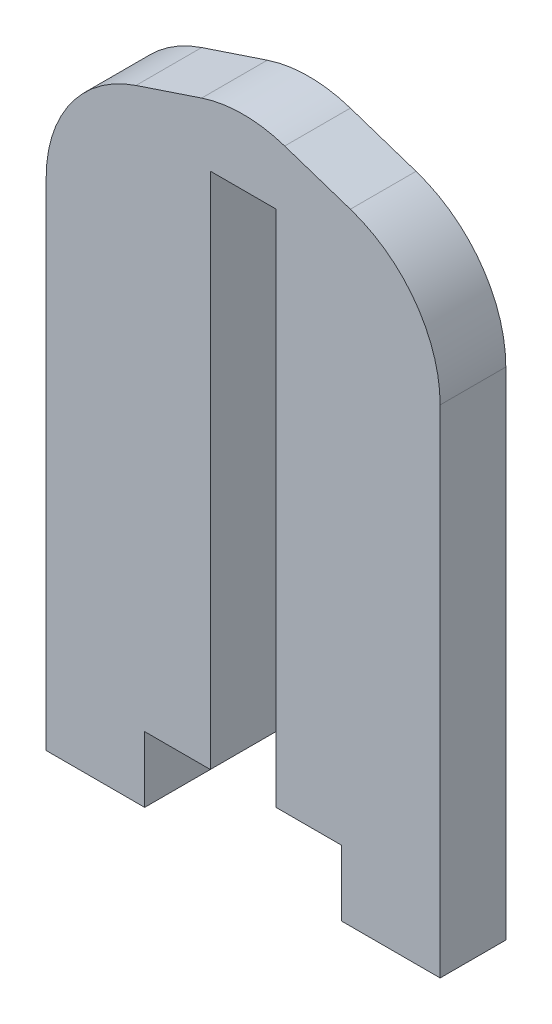
ISO-10303-21;
HEADER;
FILE_DESCRIPTION(('STEP AP214'),'2;1');
FILE_NAME('part.step','',(''),(''),'','','');
FILE_SCHEMA(('AUTOMOTIVE_DESIGN { 1 0 10303 214 1 1 1 1 }'));
ENDSEC;
DATA;
#1=APPLICATION_CONTEXT('core data for automotive mechanical design processes');
#2=APPLICATION_PROTOCOL_DEFINITION('international standard','automotive_design',2000,#1);
#3=PRODUCT_CONTEXT('',#1,'mechanical');
#4=PRODUCT('Part','Part','',(#3));
#5=PRODUCT_RELATED_PRODUCT_CATEGORY('part','',(#4));
#6=PRODUCT_DEFINITION_FORMATION('','',#4);
#7=PRODUCT_DEFINITION_CONTEXT('part definition',#1,'design');
#8=PRODUCT_DEFINITION('design','',#6,#7);
#9=PRODUCT_DEFINITION_SHAPE('','',#8);
#10=(LENGTH_UNIT() NAMED_UNIT(*) SI_UNIT(.MILLI.,.METRE.));
#11=(NAMED_UNIT(*) PLANE_ANGLE_UNIT() SI_UNIT($,.RADIAN.));
#12=(NAMED_UNIT(*) SI_UNIT($,.STERADIAN.) SOLID_ANGLE_UNIT());
#13=UNCERTAINTY_MEASURE_WITH_UNIT(LENGTH_MEASURE(1.E-05),#10,'distance_accuracy_value','');
#14=(GEOMETRIC_REPRESENTATION_CONTEXT(3) GLOBAL_UNCERTAINTY_ASSIGNED_CONTEXT((#13)) GLOBAL_UNIT_ASSIGNED_CONTEXT((#10,
#11,#12)) REPRESENTATION_CONTEXT('',''));
#15=CARTESIAN_POINT('',(0.,0.,0.));
#16=DIRECTION('',(0.,0.,1.));
#17=DIRECTION('',(1.,0.,0.));
#18=AXIS2_PLACEMENT_3D('',#15,#16,#17);
#19=CARTESIAN_POINT('',(-9.525,-31.75,6.35));
#20=DIRECTION('',(0.,1.,0.));
#21=DIRECTION('',(0.,0.,1.));
#22=AXIS2_PLACEMENT_3D('',#19,#20,#21);
#23=PLANE('',#22);
#24=DIRECTION('',(1.,0.,0.));
#25=VECTOR('',#24,1.);
#26=CARTESIAN_POINT('',(-9.525,-31.75,6.35));
#27=LINE('',#26,#25);
#28=CARTESIAN_POINT('',(3.17500000000001,-31.75,6.35));
#29=VERTEX_POINT('',#28);
#30=CARTESIAN_POINT('',(9.525,-31.75,6.35));
#31=VERTEX_POINT('',#30);
#32=EDGE_CURVE('E210',#29,#31,#27,.T.);
#33=ORIENTED_EDGE('',*,*,#32,.F.);
#34=DIRECTION('',(0.,0.,1.));
#35=VECTOR('',#34,1.);
#36=CARTESIAN_POINT('',(3.17500000000001,-31.75,0.));
#37=LINE('',#36,#35);
#38=CARTESIAN_POINT('',(3.17500000000001,-31.75,0.));
#39=VERTEX_POINT('',#38);
#40=EDGE_CURVE('E182',#39,#29,#37,.T.);
#41=ORIENTED_EDGE('',*,*,#40,.F.);
#42=DIRECTION('',(1.,0.,0.));
#43=VECTOR('',#42,1.);
#44=CARTESIAN_POINT('',(-9.525,-31.75,0.));
#45=LINE('',#44,#43);
#46=CARTESIAN_POINT('',(9.525,-31.75,0.));
#47=VERTEX_POINT('',#46);
#48=EDGE_CURVE('E176',#39,#47,#45,.T.);
#49=ORIENTED_EDGE('',*,*,#48,.T.);
#50=DIRECTION('',(0.,0.,-1.));
#51=VECTOR('',#50,1.);
#52=CARTESIAN_POINT('',(9.525,-31.75,6.35));
#53=LINE('',#52,#51);
#54=EDGE_CURVE('E269',#31,#47,#53,.T.);
#55=ORIENTED_EDGE('',*,*,#54,.F.);
#56=EDGE_LOOP('',(#33,#41,#49,#55));
#57=FACE_BOUND('',#56,.T.);
#58=ADVANCED_FACE('F39',(#57),#23,.F.);
#59=CARTESIAN_POINT('',(-19.05,-38.1,6.35));
#60=DIRECTION('',(0.,1.,0.));
#61=DIRECTION('',(0.,0.,1.));
#62=AXIS2_PLACEMENT_3D('',#59,#60,#61);
#63=PLANE('',#62);
#64=DIRECTION('',(1.,0.,0.));
#65=VECTOR('',#64,1.);
#66=CARTESIAN_POINT('',(-19.05,-38.1,0.));
#67=LINE('',#66,#65);
#68=CARTESIAN_POINT('',(-19.05,-38.1,0.));
#69=VERTEX_POINT('',#68);
#70=CARTESIAN_POINT('',(-9.525,-38.1,0.));
#71=VERTEX_POINT('',#70);
#72=EDGE_CURVE('E199',#69,#71,#67,.T.);
#73=ORIENTED_EDGE('',*,*,#72,.T.);
#74=DIRECTION('',(0.,0.,-1.));
#75=VECTOR('',#74,1.);
#76=CARTESIAN_POINT('',(-9.525,-38.1,6.35));
#77=LINE('',#76,#75);
#78=CARTESIAN_POINT('',(-9.525,-38.1,6.35));
#79=VERTEX_POINT('',#78);
#80=EDGE_CURVE('E277',#79,#71,#77,.T.);
#81=ORIENTED_EDGE('',*,*,#80,.F.);
#82=DIRECTION('',(1.,0.,0.));
#83=VECTOR('',#82,1.);
#84=CARTESIAN_POINT('',(-19.05,-38.1,6.35));
#85=LINE('',#84,#83);
#86=CARTESIAN_POINT('',(-19.05,-38.1,6.35));
#87=VERTEX_POINT('',#86);
#88=EDGE_CURVE('E203',#87,#79,#85,.T.);
#89=ORIENTED_EDGE('',*,*,#88,.F.);
#90=DIRECTION('',(0.,0.,-1.));
#91=VECTOR('',#90,1.);
#92=CARTESIAN_POINT('',(-19.05,-38.1,6.35));
#93=LINE('',#92,#91);
#94=EDGE_CURVE('E281',#87,#69,#93,.T.);
#95=ORIENTED_EDGE('',*,*,#94,.T.);
#96=EDGE_LOOP('',(#73,#81,#89,#95));
#97=FACE_BOUND('',#96,.T.);
#98=ADVANCED_FACE('F347',(#97),#63,.F.);
#99=CARTESIAN_POINT('',(-9.525,-31.75,6.35));
#100=DIRECTION('',(-1.,0.,0.));
#101=DIRECTION('',(0.,0.,1.));
#102=AXIS2_PLACEMENT_3D('',#99,#100,#101);
#103=PLANE('',#102);
#104=DIRECTION('',(0.,1.,0.));
#105=VECTOR('',#104,1.);
#106=CARTESIAN_POINT('',(-9.525,-31.75,0.));
#107=LINE('',#106,#105);
#108=CARTESIAN_POINT('',(-9.525,-31.75,0.));
#109=VERTEX_POINT('',#108);
#110=EDGE_CURVE('E235',#71,#109,#107,.T.);
#111=ORIENTED_EDGE('',*,*,#110,.T.);
#112=DIRECTION('',(0.,0.,-1.));
#113=VECTOR('',#112,1.);
#114=CARTESIAN_POINT('',(-9.525,-31.75,6.35));
#115=LINE('',#114,#113);
#116=CARTESIAN_POINT('',(-9.525,-31.75,6.35));
#117=VERTEX_POINT('',#116);
#118=EDGE_CURVE('E273',#117,#109,#115,.T.);
#119=ORIENTED_EDGE('',*,*,#118,.F.);
#120=DIRECTION('',(0.,1.,0.));
#121=VECTOR('',#120,1.);
#122=CARTESIAN_POINT('',(-9.525,-31.75,6.35));
#123=LINE('',#122,#121);
#124=EDGE_CURVE('E207',#79,#117,#123,.T.);
#125=ORIENTED_EDGE('',*,*,#124,.F.);
#126=ORIENTED_EDGE('',*,*,#80,.T.);
#127=EDGE_LOOP('',(#111,#119,#125,#126));
#128=FACE_BOUND('',#127,.T.);
#129=ADVANCED_FACE('F353',(#128),#103,.F.);
#130=CARTESIAN_POINT('',(-3.17499999999999,-31.75,0.));
#131=VERTEX_POINT('',#130);
#132=EDGE_CURVE('E238',#109,#131,#45,.T.);
#133=ORIENTED_EDGE('',*,*,#132,.T.);
#134=DIRECTION('',(0.,0.,1.));
#135=VECTOR('',#134,1.);
#136=CARTESIAN_POINT('',(-3.17499999999999,-31.75,0.));
#137=LINE('',#136,#135);
#138=CARTESIAN_POINT('',(-3.17499999999999,-31.75,6.35));
#139=VERTEX_POINT('',#138);
#140=EDGE_CURVE('E186',#131,#139,#137,.T.);
#141=ORIENTED_EDGE('',*,*,#140,.T.);
#142=EDGE_CURVE('E211',#117,#139,#27,.T.);
#143=ORIENTED_EDGE('',*,*,#142,.F.);
#144=ORIENTED_EDGE('',*,*,#118,.T.);
#145=EDGE_LOOP('',(#133,#141,#143,#144));
#146=FACE_BOUND('',#145,.T.);
#147=ADVANCED_FACE('F355',(#146),#23,.F.);
#148=CARTESIAN_POINT('',(9.525,-31.75,6.35));
#149=DIRECTION('',(1.,0.,0.));
#150=DIRECTION('',(0.,0.,-1.));
#151=AXIS2_PLACEMENT_3D('',#148,#149,#150);
#152=PLANE('',#151);
#153=DIRECTION('',(0.,-1.,0.));
#154=VECTOR('',#153,1.);
#155=CARTESIAN_POINT('',(9.525,-31.75,0.));
#156=LINE('',#155,#154);
#157=CARTESIAN_POINT('',(9.525,-38.1,0.));
#158=VERTEX_POINT('',#157);
#159=EDGE_CURVE('E242',#47,#158,#156,.T.);
#160=ORIENTED_EDGE('',*,*,#159,.T.);
#161=DIRECTION('',(0.,0.,-1.));
#162=VECTOR('',#161,1.);
#163=CARTESIAN_POINT('',(9.525,-38.1,6.35));
#164=LINE('',#163,#162);
#165=CARTESIAN_POINT('',(9.525,-38.1,6.35));
#166=VERTEX_POINT('',#165);
#167=EDGE_CURVE('E265',#166,#158,#164,.T.);
#168=ORIENTED_EDGE('',*,*,#167,.F.);
#169=DIRECTION('',(0.,-1.,0.));
#170=VECTOR('',#169,1.);
#171=CARTESIAN_POINT('',(9.525,-31.75,6.35));
#172=LINE('',#171,#170);
#173=EDGE_CURVE('E215',#31,#166,#172,.T.);
#174=ORIENTED_EDGE('',*,*,#173,.F.);
#175=ORIENTED_EDGE('',*,*,#54,.T.);
#176=EDGE_LOOP('',(#160,#168,#174,#175));
#177=FACE_BOUND('',#176,.T.);
#178=ADVANCED_FACE('F364',(#177),#152,.F.);
#179=CARTESIAN_POINT('',(19.05,-38.1,6.35));
#180=DIRECTION('',(0.,1.,0.));
#181=DIRECTION('',(-1.,0.,0.));
#182=AXIS2_PLACEMENT_3D('',#179,#180,#181);
#183=PLANE('',#182);
#184=DIRECTION('',(1.,0.,0.));
#185=VECTOR('',#184,1.);
#186=CARTESIAN_POINT('',(19.05,-38.1,0.));
#187=LINE('',#186,#185);
#188=CARTESIAN_POINT('',(19.05,-38.1,0.));
#189=VERTEX_POINT('',#188);
#190=EDGE_CURVE('E245',#158,#189,#187,.T.);
#191=ORIENTED_EDGE('',*,*,#190,.T.);
#192=DIRECTION('',(0.,0.,-1.));
#193=VECTOR('',#192,1.);
#194=CARTESIAN_POINT('',(19.05,-38.1,6.35));
#195=LINE('',#194,#193);
#196=CARTESIAN_POINT('',(19.05,-38.1,6.35));
#197=VERTEX_POINT('',#196);
#198=EDGE_CURVE('E232',#197,#189,#195,.T.);
#199=ORIENTED_EDGE('',*,*,#198,.F.);
#200=DIRECTION('',(1.,0.,0.));
#201=VECTOR('',#200,1.);
#202=CARTESIAN_POINT('',(19.05,-38.1,6.35));
#203=LINE('',#202,#201);
#204=EDGE_CURVE('E218',#166,#197,#203,.T.);
#205=ORIENTED_EDGE('',*,*,#204,.F.);
#206=ORIENTED_EDGE('',*,*,#167,.T.);
#207=EDGE_LOOP('',(#191,#199,#205,#206));
#208=FACE_BOUND('',#207,.T.);
#209=ADVANCED_FACE('F369',(#208),#183,.F.);
#210=CARTESIAN_POINT('',(19.05,-31.75,6.35));
#211=DIRECTION('',(-1.,0.,0.));
#212=DIRECTION('',(0.,0.,1.));
#213=AXIS2_PLACEMENT_3D('',#210,#211,#212);
#214=PLANE('',#213);
#215=DIRECTION('',(0.,1.,0.));
#216=VECTOR('',#215,1.);
#217=CARTESIAN_POINT('',(19.05,-31.75,0.));
#218=LINE('',#217,#216);
#219=CARTESIAN_POINT('',(19.05,9.89635790528719,0.));
#220=VERTEX_POINT('',#219);
#221=EDGE_CURVE('E249',#189,#220,#218,.T.);
#222=ORIENTED_EDGE('',*,*,#221,.T.);
#223=DIRECTION('',(0.,0.,-1.));
#224=VECTOR('',#223,1.);
#225=CARTESIAN_POINT('',(19.05,9.89635790528719,6.35));
#226=LINE('',#225,#224);
#227=CARTESIAN_POINT('',(19.05,9.89635790528719,6.35));
#228=VERTEX_POINT('',#227);
#229=EDGE_CURVE('E11',#220,#228,#226,.F.);
#230=ORIENTED_EDGE('',*,*,#229,.T.);
#231=DIRECTION('',(0.,1.,0.));
#232=VECTOR('',#231,1.);
#233=CARTESIAN_POINT('',(19.05,-31.75,6.35));
#234=LINE('',#233,#232);
#235=EDGE_CURVE('E221',#197,#228,#234,.T.);
#236=ORIENTED_EDGE('',*,*,#235,.F.);
#237=ORIENTED_EDGE('',*,*,#198,.T.);
#238=EDGE_LOOP('',(#222,#230,#236,#237));
#239=FACE_BOUND('',#238,.T.);
#240=ADVANCED_FACE('F373',(#239),#214,.F.);
#241=CARTESIAN_POINT('',(0.,25.4,6.35));
#242=DIRECTION('',(-0.316227766016838,-0.948683298050514,0.));
#243=DIRECTION('',(0.948683298050514,-0.316227766016838,0.));
#244=AXIS2_PLACEMENT_3D('',#241,#242,#243);
#245=PLANE('',#244);
#246=DIRECTION('',(-0.948683298050514,0.316227766016838,0.));
#247=VECTOR('',#246,1.);
#248=CARTESIAN_POINT('',(0.,25.4,6.35));
#249=LINE('',#248,#247);
#250=CARTESIAN_POINT('',(10.3660926284138,21.9446357905287,6.35));
#251=VERTEX_POINT('',#250);
#252=CARTESIAN_POINT('',(4.01609262841383,24.0613024571954,6.35));
#253=VERTEX_POINT('',#252);
#254=EDGE_CURVE('E225',#251,#253,#249,.T.);
#255=ORIENTED_EDGE('',*,*,#254,.F.);
#256=DIRECTION('',(0.,0.,-1.));
#257=VECTOR('',#256,1.);
#258=CARTESIAN_POINT('',(10.3660926284138,21.9446357905287,6.35));
#259=LINE('',#258,#257);
#260=CARTESIAN_POINT('',(10.3660926284138,21.9446357905287,0.));
#261=VERTEX_POINT('',#260);
#262=EDGE_CURVE('E48',#251,#261,#259,.T.);
#263=ORIENTED_EDGE('',*,*,#262,.T.);
#264=DIRECTION('',(-0.948683298050514,0.316227766016838,0.));
#265=VECTOR('',#264,1.);
#266=CARTESIAN_POINT('',(0.,25.4,0.));
#267=LINE('',#266,#265);
#268=CARTESIAN_POINT('',(4.01609262841383,24.0613024571954,0.));
#269=VERTEX_POINT('',#268);
#270=EDGE_CURVE('E253',#261,#269,#267,.T.);
#271=ORIENTED_EDGE('',*,*,#270,.T.);
#272=DIRECTION('',(0.,0.,-1.));
#273=VECTOR('',#272,1.);
#274=CARTESIAN_POINT('',(4.01609262841383,24.0613024571954,6.35));
#275=LINE('',#274,#273);
#276=EDGE_CURVE('E63',#269,#253,#275,.F.);
#277=ORIENTED_EDGE('',*,*,#276,.T.);
#278=EDGE_LOOP('',(#255,#263,#271,#277));
#279=FACE_BOUND('',#278,.T.);
#280=ADVANCED_FACE('F319',(#279),#245,.F.);
#281=CARTESIAN_POINT('',(-19.05,19.05,6.35));
#282=DIRECTION('',(0.316227766016838,-0.948683298050514,0.));
#283=DIRECTION('',(0.948683298050514,0.316227766016838,0.));
#284=AXIS2_PLACEMENT_3D('',#281,#282,#283);
#285=PLANE('',#284);
#286=DIRECTION('',(-0.948683298050514,-0.316227766016838,0.));
#287=VECTOR('',#286,1.);
#288=CARTESIAN_POINT('',(-19.05,19.05,0.));
#289=LINE('',#288,#287);
#290=CARTESIAN_POINT('',(-4.01609262841385,24.0613024571954,0.));
#291=VERTEX_POINT('',#290);
#292=CARTESIAN_POINT('',(-10.3660926284138,21.9446357905287,0.));
#293=VERTEX_POINT('',#292);
#294=EDGE_CURVE('E256',#291,#293,#289,.T.);
#295=ORIENTED_EDGE('',*,*,#294,.T.);
#296=DIRECTION('',(0.,0.,-1.));
#297=VECTOR('',#296,1.);
#298=CARTESIAN_POINT('',(-10.3660926284138,21.9446357905287,6.35));
#299=LINE('',#298,#297);
#300=CARTESIAN_POINT('',(-10.3660926284138,21.9446357905287,6.35));
#301=VERTEX_POINT('',#300);
#302=EDGE_CURVE('E302',#293,#301,#299,.F.);
#303=ORIENTED_EDGE('',*,*,#302,.T.);
#304=DIRECTION('',(-0.948683298050514,-0.316227766016838,0.));
#305=VECTOR('',#304,1.);
#306=CARTESIAN_POINT('',(-19.05,19.05,6.35));
#307=LINE('',#306,#305);
#308=CARTESIAN_POINT('',(-4.01609262841385,24.0613024571954,6.35));
#309=VERTEX_POINT('',#308);
#310=EDGE_CURVE('E228',#309,#301,#307,.T.);
#311=ORIENTED_EDGE('',*,*,#310,.F.);
#312=DIRECTION('',(0.,0.,-1.));
#313=VECTOR('',#312,1.);
#314=CARTESIAN_POINT('',(-4.01609262841385,24.0613024571954,6.35));
#315=LINE('',#314,#313);
#316=EDGE_CURVE('E298',#309,#291,#315,.T.);
#317=ORIENTED_EDGE('',*,*,#316,.T.);
#318=EDGE_LOOP('',(#295,#303,#311,#317));
#319=FACE_BOUND('',#318,.T.);
#320=ADVANCED_FACE('F328',(#319),#285,.F.);
#321=CARTESIAN_POINT('',(-19.05,-31.75,6.35));
#322=DIRECTION('',(1.,0.,0.));
#323=DIRECTION('',(0.,0.,-1.));
#324=AXIS2_PLACEMENT_3D('',#321,#322,#323);
#325=PLANE('',#324);
#326=DIRECTION('',(0.,-1.,0.));
#327=VECTOR('',#326,1.);
#328=CARTESIAN_POINT('',(-19.05,-31.75,6.35));
#329=LINE('',#328,#327);
#330=CARTESIAN_POINT('',(-19.05,9.89635790528719,6.35));
#331=VERTEX_POINT('',#330);
#332=EDGE_CURVE('E200',#331,#87,#329,.T.);
#333=ORIENTED_EDGE('',*,*,#332,.F.);
#334=DIRECTION('',(0.,0.,-1.));
#335=VECTOR('',#334,1.);
#336=CARTESIAN_POINT('',(-19.05,9.89635790528719,6.35));
#337=LINE('',#336,#335);
#338=CARTESIAN_POINT('',(-19.05,9.89635790528719,0.));
#339=VERTEX_POINT('',#338);
#340=EDGE_CURVE('E285',#331,#339,#337,.T.);
#341=ORIENTED_EDGE('',*,*,#340,.T.);
#342=DIRECTION('',(0.,-1.,0.));
#343=VECTOR('',#342,1.);
#344=CARTESIAN_POINT('',(-19.05,-31.75,0.));
#345=LINE('',#344,#343);
#346=EDGE_CURVE('E204',#339,#69,#345,.T.);
#347=ORIENTED_EDGE('',*,*,#346,.T.);
#348=ORIENTED_EDGE('',*,*,#94,.F.);
#349=EDGE_LOOP('',(#333,#341,#347,#348));
#350=FACE_BOUND('',#349,.T.);
#351=ADVANCED_FACE('F339',(#350),#325,.F.);
#352=CARTESIAN_POINT('',(0.,0.,6.35));
#353=DIRECTION('',(0.,0.,1.));
#354=DIRECTION('',(1.,0.,0.));
#355=AXIS2_PLACEMENT_3D('',#352,#353,#354);
#356=PLANE('',#355);
#357=DIRECTION('',(0.,1.,0.));
#358=VECTOR('',#357,1.);
#359=CARTESIAN_POINT('',(3.175,0.,6.35));
#360=LINE('',#359,#358);
#361=CARTESIAN_POINT('',(3.175,18.3630245719539,6.35));
#362=VERTEX_POINT('',#361);
#363=EDGE_CURVE('E161',#29,#362,#360,.T.);
#364=ORIENTED_EDGE('',*,*,#363,.F.);
#365=ORIENTED_EDGE('',*,*,#32,.T.);
#366=ORIENTED_EDGE('',*,*,#173,.T.);
#367=ORIENTED_EDGE('',*,*,#204,.T.);
#368=ORIENTED_EDGE('',*,*,#235,.T.);
#369=CARTESIAN_POINT('',(6.35,9.89635790528719,6.35));
#370=DIRECTION('',(0.,0.,1.));
#371=DIRECTION('',(1.,0.,0.));
#372=AXIS2_PLACEMENT_3D('',#369,#370,#371);
#373=CIRCLE('',#372,12.7);
#374=EDGE_CURVE('E308',#228,#251,#373,.T.);
#375=ORIENTED_EDGE('',*,*,#374,.T.);
#376=ORIENTED_EDGE('',*,*,#254,.T.);
#377=CARTESIAN_POINT('',(0.,12.0130245719539,6.35));
#378=DIRECTION('',(0.,0.,1.));
#379=DIRECTION('',(1.,0.,0.));
#380=AXIS2_PLACEMENT_3D('',#377,#378,#379);
#381=CIRCLE('',#380,12.7);
#382=EDGE_CURVE('E305',#253,#309,#381,.T.);
#383=ORIENTED_EDGE('',*,*,#382,.T.);
#384=ORIENTED_EDGE('',*,*,#310,.T.);
#385=CARTESIAN_POINT('',(-6.35,9.89635790528719,6.35));
#386=DIRECTION('',(0.,0.,1.));
#387=DIRECTION('',(1.,0.,0.));
#388=AXIS2_PLACEMENT_3D('',#385,#386,#387);
#389=CIRCLE('',#388,12.7);
#390=EDGE_CURVE('E311',#301,#331,#389,.T.);
#391=ORIENTED_EDGE('',*,*,#390,.T.);
#392=ORIENTED_EDGE('',*,*,#332,.T.);
#393=ORIENTED_EDGE('',*,*,#88,.T.);
#394=ORIENTED_EDGE('',*,*,#124,.T.);
#395=ORIENTED_EDGE('',*,*,#142,.T.);
#396=DIRECTION('',(0.,-1.,0.));
#397=VECTOR('',#396,1.);
#398=CARTESIAN_POINT('',(-3.175,0.,6.35));
#399=LINE('',#398,#397);
#400=CARTESIAN_POINT('',(-3.175,18.3630245719539,6.35));
#401=VERTEX_POINT('',#400);
#402=EDGE_CURVE('E194',#401,#139,#399,.T.);
#403=ORIENTED_EDGE('',*,*,#402,.F.);
#404=DIRECTION('',(-1.,0.,0.));
#405=VECTOR('',#404,1.);
#406=CARTESIAN_POINT('',(0.,18.3630245719539,6.35));
#407=LINE('',#406,#405);
#408=EDGE_CURVE('E185',#362,#401,#407,.T.);
#409=ORIENTED_EDGE('',*,*,#408,.F.);
#410=EDGE_LOOP('',(#364,#365,#366,#367,#368,#375,#376,#383,#384,#391,#392,#393,#394,#395,#403,#409));
#411=FACE_BOUND('',#410,.T.);
#412=ADVANCED_FACE('F332',(#411),#356,.T.);
#413=CARTESIAN_POINT('',(0.,0.,0.));
#414=DIRECTION('',(0.,0.,1.));
#415=DIRECTION('',(1.,0.,0.));
#416=AXIS2_PLACEMENT_3D('',#413,#414,#415);
#417=PLANE('',#416);
#418=ORIENTED_EDGE('',*,*,#48,.F.);
#419=DIRECTION('',(0.,1.,0.));
#420=VECTOR('',#419,1.);
#421=CARTESIAN_POINT('',(3.175,18.3630245719539,0.));
#422=LINE('',#421,#420);
#423=CARTESIAN_POINT('',(3.175,18.3630245719539,0.));
#424=VERTEX_POINT('',#423);
#425=EDGE_CURVE('E158',#39,#424,#422,.T.);
#426=ORIENTED_EDGE('',*,*,#425,.T.);
#427=DIRECTION('',(-1.,0.,0.));
#428=VECTOR('',#427,1.);
#429=CARTESIAN_POINT('',(-3.175,18.3630245719539,0.));
#430=LINE('',#429,#428);
#431=CARTESIAN_POINT('',(-3.175,18.3630245719539,0.));
#432=VERTEX_POINT('',#431);
#433=EDGE_CURVE('E168',#424,#432,#430,.T.);
#434=ORIENTED_EDGE('',*,*,#433,.T.);
#435=DIRECTION('',(0.,-1.,0.));
#436=VECTOR('',#435,1.);
#437=CARTESIAN_POINT('',(-3.175,18.3630245719539,0.));
#438=LINE('',#437,#436);
#439=EDGE_CURVE('E55',#432,#131,#438,.T.);
#440=ORIENTED_EDGE('',*,*,#439,.T.);
#441=ORIENTED_EDGE('',*,*,#132,.F.);
#442=ORIENTED_EDGE('',*,*,#110,.F.);
#443=ORIENTED_EDGE('',*,*,#72,.F.);
#444=ORIENTED_EDGE('',*,*,#346,.F.);
#445=CARTESIAN_POINT('',(-6.35,9.89635790528719,0.));
#446=DIRECTION('',(0.,0.,1.));
#447=DIRECTION('',(1.,0.,0.));
#448=AXIS2_PLACEMENT_3D('',#445,#446,#447);
#449=CIRCLE('',#448,12.7);
#450=EDGE_CURVE('E295',#339,#293,#449,.F.);
#451=ORIENTED_EDGE('',*,*,#450,.T.);
#452=ORIENTED_EDGE('',*,*,#294,.F.);
#453=CARTESIAN_POINT('',(0.,12.0130245719539,0.));
#454=DIRECTION('',(0.,0.,1.));
#455=DIRECTION('',(1.,0.,0.));
#456=AXIS2_PLACEMENT_3D('',#453,#454,#455);
#457=CIRCLE('',#456,12.7);
#458=EDGE_CURVE('E289',#291,#269,#457,.F.);
#459=ORIENTED_EDGE('',*,*,#458,.T.);
#460=ORIENTED_EDGE('',*,*,#270,.F.);
#461=CARTESIAN_POINT('',(6.35,9.89635790528719,0.));
#462=DIRECTION('',(0.,0.,1.));
#463=DIRECTION('',(1.,0.,0.));
#464=AXIS2_PLACEMENT_3D('',#461,#462,#463);
#465=CIRCLE('',#464,12.7);
#466=EDGE_CURVE('E292',#261,#220,#465,.F.);
#467=ORIENTED_EDGE('',*,*,#466,.T.);
#468=ORIENTED_EDGE('',*,*,#221,.F.);
#469=ORIENTED_EDGE('',*,*,#190,.F.);
#470=ORIENTED_EDGE('',*,*,#159,.F.);
#471=EDGE_LOOP('',(#418,#426,#434,#440,#441,#442,#443,#444,#451,#452,#459,#460,#467,#468,#469,#470));
#472=FACE_BOUND('',#471,.T.);
#473=ADVANCED_FACE('F174',(#472),#417,.F.);
#474=CARTESIAN_POINT('',(-6.35,9.89635790528719,6.35));
#475=DIRECTION('',(0.,0.,-1.));
#476=DIRECTION('',(-1.,0.,0.));
#477=AXIS2_PLACEMENT_3D('',#474,#475,#476);
#478=CYLINDRICAL_SURFACE('',#477,12.7);
#479=ORIENTED_EDGE('',*,*,#390,.F.);
#480=ORIENTED_EDGE('',*,*,#302,.F.);
#481=ORIENTED_EDGE('',*,*,#450,.F.);
#482=ORIENTED_EDGE('',*,*,#340,.F.);
#483=EDGE_LOOP('',(#479,#480,#481,#482));
#484=FACE_BOUND('',#483,.T.);
#485=ADVANCED_FACE('F336',(#484),#478,.T.);
#486=CARTESIAN_POINT('',(6.35,9.89635790528719,6.35));
#487=DIRECTION('',(0.,0.,-1.));
#488=DIRECTION('',(-1.,0.,0.));
#489=AXIS2_PLACEMENT_3D('',#486,#487,#488);
#490=CYLINDRICAL_SURFACE('',#489,12.7);
#491=ORIENTED_EDGE('',*,*,#374,.F.);
#492=ORIENTED_EDGE('',*,*,#229,.F.);
#493=ORIENTED_EDGE('',*,*,#466,.F.);
#494=ORIENTED_EDGE('',*,*,#262,.F.);
#495=EDGE_LOOP('',(#491,#492,#493,#494));
#496=FACE_BOUND('',#495,.T.);
#497=ADVANCED_FACE('F375',(#496),#490,.T.);
#498=CARTESIAN_POINT('',(0.,12.0130245719539,6.35));
#499=DIRECTION('',(0.,0.,-1.));
#500=DIRECTION('',(-1.,0.,0.));
#501=AXIS2_PLACEMENT_3D('',#498,#499,#500);
#502=CYLINDRICAL_SURFACE('',#501,12.7);
#503=ORIENTED_EDGE('',*,*,#382,.F.);
#504=ORIENTED_EDGE('',*,*,#276,.F.);
#505=ORIENTED_EDGE('',*,*,#458,.F.);
#506=ORIENTED_EDGE('',*,*,#316,.F.);
#507=EDGE_LOOP('',(#503,#504,#505,#506));
#508=FACE_BOUND('',#507,.T.);
#509=ADVANCED_FACE('F41',(#508),#502,.T.);
#510=CARTESIAN_POINT('',(3.175,18.3630245719539,0.));
#511=DIRECTION('',(1.,0.,0.));
#512=DIRECTION('',(0.,1.,0.));
#513=AXIS2_PLACEMENT_3D('',#510,#511,#512);
#514=PLANE('',#513);
#515=ORIENTED_EDGE('',*,*,#363,.T.);
#516=DIRECTION('',(0.,0.,1.));
#517=VECTOR('',#516,1.);
#518=CARTESIAN_POINT('',(3.175,18.3630245719539,0.));
#519=LINE('',#518,#517);
#520=EDGE_CURVE('E154',#424,#362,#519,.T.);
#521=ORIENTED_EDGE('',*,*,#520,.F.);
#522=ORIENTED_EDGE('',*,*,#425,.F.);
#523=ORIENTED_EDGE('',*,*,#40,.T.);
#524=EDGE_LOOP('',(#515,#521,#522,#523));
#525=FACE_BOUND('',#524,.T.);
#526=ADVANCED_FACE('F156',(#525),#514,.F.);
#527=CARTESIAN_POINT('',(-3.175,18.3630245719539,0.));
#528=DIRECTION('',(-1.,0.,0.));
#529=DIRECTION('',(0.,-1.,0.));
#530=AXIS2_PLACEMENT_3D('',#527,#528,#529);
#531=PLANE('',#530);
#532=ORIENTED_EDGE('',*,*,#402,.T.);
#533=ORIENTED_EDGE('',*,*,#140,.F.);
#534=ORIENTED_EDGE('',*,*,#439,.F.);
#535=DIRECTION('',(0.,0.,1.));
#536=VECTOR('',#535,1.);
#537=CARTESIAN_POINT('',(-3.175,18.3630245719539,0.));
#538=LINE('',#537,#536);
#539=EDGE_CURVE('E165',#432,#401,#538,.T.);
#540=ORIENTED_EDGE('',*,*,#539,.T.);
#541=EDGE_LOOP('',(#532,#533,#534,#540));
#542=FACE_BOUND('',#541,.T.);
#543=ADVANCED_FACE('F356',(#542),#531,.F.);
#544=CARTESIAN_POINT('',(-3.175,18.3630245719539,0.));
#545=DIRECTION('',(0.,1.,0.));
#546=DIRECTION('',(0.,0.,1.));
#547=AXIS2_PLACEMENT_3D('',#544,#545,#546);
#548=PLANE('',#547);
#549=ORIENTED_EDGE('',*,*,#408,.T.);
#550=ORIENTED_EDGE('',*,*,#539,.F.);
#551=ORIENTED_EDGE('',*,*,#433,.F.);
#552=ORIENTED_EDGE('',*,*,#520,.T.);
#553=EDGE_LOOP('',(#549,#550,#551,#552));
#554=FACE_BOUND('',#553,.T.);
#555=ADVANCED_FACE('F169',(#554),#548,.F.);
#556=CLOSED_SHELL('',(#58,#98,#129,#147,#178,#209,#240,#280,#320,#351,#412,#473,#485,#497,#509,
#526,#543,#555));
#557=MANIFOLD_SOLID_BREP('B2',#556);
#558=ADVANCED_BREP_SHAPE_REPRESENTATION('',(#18,#557),#14);
#559=SHAPE_DEFINITION_REPRESENTATION(#9,#558);
ENDSEC;
END-ISO-10303-21;
